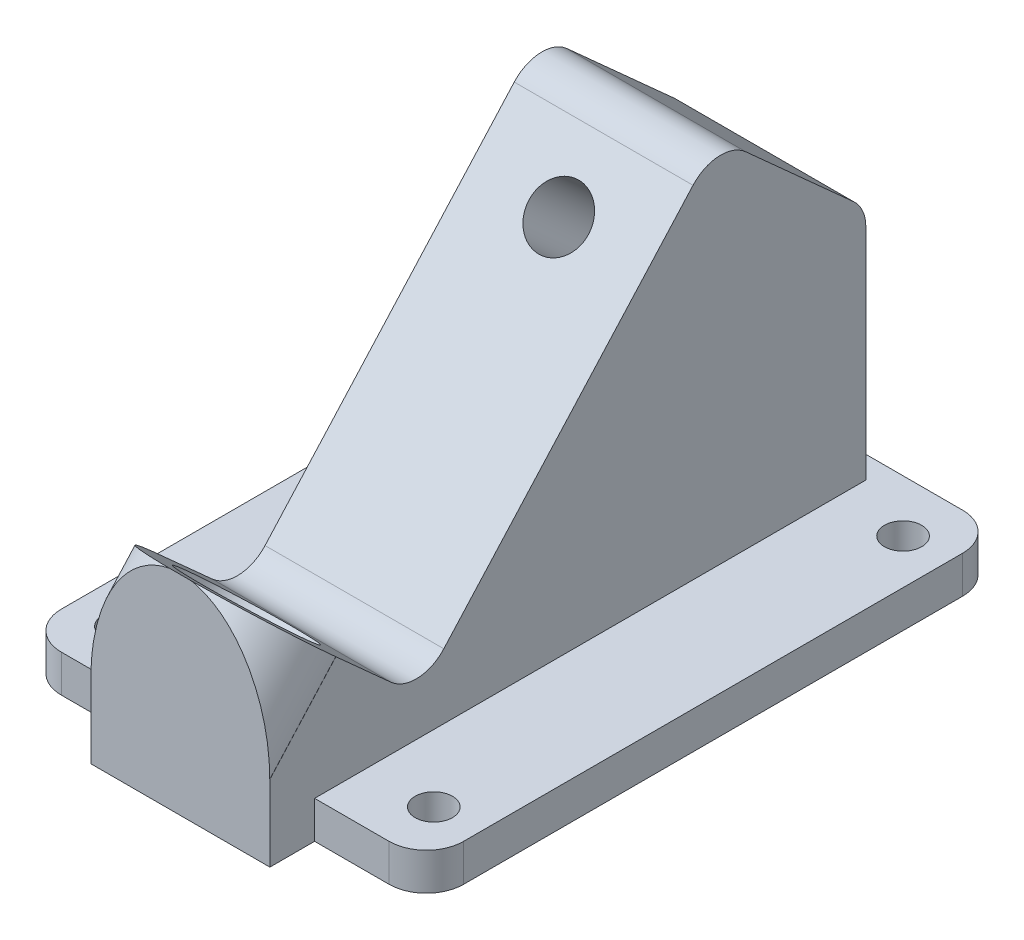
ISO-10303-21;
HEADER;
FILE_DESCRIPTION(('STEP AP214'),'2;1');
FILE_NAME('part.step','',(''),(''),'','','');
FILE_SCHEMA(('AUTOMOTIVE_DESIGN { 1 0 10303 214 1 1 1 1 }'));
ENDSEC;
DATA;
#1=APPLICATION_CONTEXT('core data for automotive mechanical design processes');
#2=APPLICATION_PROTOCOL_DEFINITION('international standard','automotive_design',2000,#1);
#3=PRODUCT_CONTEXT('',#1,'mechanical');
#4=PRODUCT('Part','Part','',(#3));
#5=PRODUCT_RELATED_PRODUCT_CATEGORY('part','',(#4));
#6=PRODUCT_DEFINITION_FORMATION('','',#4);
#7=PRODUCT_DEFINITION_CONTEXT('part definition',#1,'design');
#8=PRODUCT_DEFINITION('design','',#6,#7);
#9=PRODUCT_DEFINITION_SHAPE('','',#8);
#10=(LENGTH_UNIT() NAMED_UNIT(*) SI_UNIT(.MILLI.,.METRE.));
#11=(NAMED_UNIT(*) PLANE_ANGLE_UNIT() SI_UNIT($,.RADIAN.));
#12=(NAMED_UNIT(*) SI_UNIT($,.STERADIAN.) SOLID_ANGLE_UNIT());
#13=UNCERTAINTY_MEASURE_WITH_UNIT(LENGTH_MEASURE(1.E-05),#10,'distance_accuracy_value','');
#14=(GEOMETRIC_REPRESENTATION_CONTEXT(3) GLOBAL_UNCERTAINTY_ASSIGNED_CONTEXT((#13)) GLOBAL_UNIT_ASSIGNED_CONTEXT((#10,
#11,#12)) REPRESENTATION_CONTEXT('',''));
#15=CARTESIAN_POINT('',(0.,0.,0.));
#16=DIRECTION('',(0.,0.,1.));
#17=DIRECTION('',(1.,0.,0.));
#18=AXIS2_PLACEMENT_3D('',#15,#16,#17);
#19=CARTESIAN_POINT('',(-12.,-83.5224520712844,-35.5));
#20=DIRECTION('',(0.,0.,-1.));
#21=DIRECTION('',(-1.,0.,0.));
#22=AXIS2_PLACEMENT_3D('',#19,#20,#21);
#23=PLANE('',#22);
#24=DIRECTION('',(0.,1.,0.));
#25=VECTOR('',#24,1.);
#26=CARTESIAN_POINT('',(-12.,-83.5224520712844,-35.5));
#27=LINE('',#26,#25);
#28=CARTESIAN_POINT('',(-12.,5.,-35.5));
#29=VERTEX_POINT('',#28);
#30=CARTESIAN_POINT('',(-12.,34.4875776919696,-35.5));
#31=VERTEX_POINT('',#30);
#32=EDGE_CURVE('E266',#29,#31,#27,.T.);
#33=ORIENTED_EDGE('',*,*,#32,.T.);
#34=DIRECTION('',(-1.,0.,0.));
#35=VECTOR('',#34,1.);
#36=CARTESIAN_POINT('',(12.,34.4875776919696,-35.5));
#37=LINE('',#36,#35);
#38=CARTESIAN_POINT('',(12.,34.4875776919696,-35.5));
#39=VERTEX_POINT('',#38);
#40=EDGE_CURVE('E344',#31,#39,#37,.F.);
#41=ORIENTED_EDGE('',*,*,#40,.T.);
#42=DIRECTION('',(0.,1.,0.));
#43=VECTOR('',#42,1.);
#44=CARTESIAN_POINT('',(12.,-83.5224520712844,-35.5));
#45=LINE('',#44,#43);
#46=CARTESIAN_POINT('',(12.,5.,-35.5));
#47=VERTEX_POINT('',#46);
#48=EDGE_CURVE('E269',#47,#39,#45,.T.);
#49=ORIENTED_EDGE('',*,*,#48,.F.);
#50=DIRECTION('',(1.,0.,0.));
#51=VECTOR('',#50,1.);
#52=CARTESIAN_POINT('',(0.,5.,-35.5));
#53=LINE('',#52,#51);
#54=EDGE_CURVE('E297',#29,#47,#53,.T.);
#55=ORIENTED_EDGE('',*,*,#54,.F.);
#56=EDGE_LOOP('',(#33,#41,#49,#55));
#57=FACE_BOUND('',#56,.T.);
#58=DIRECTION('',(1.,0.,0.));
#59=VECTOR('',#58,1.);
#60=CARTESIAN_POINT('',(-12.,9.38530614584432,-35.5));
#61=LINE('',#60,#59);
#62=CARTESIAN_POINT('',(-4.05547720070579,9.38530614584432,-35.5));
#63=VERTEX_POINT('',#62);
#64=CARTESIAN_POINT('',(4.05547720070578,9.38530614584432,-35.5));
#65=VERTEX_POINT('',#64);
#66=EDGE_CURVE('E353',#63,#65,#61,.T.);
#67=ORIENTED_EDGE('',*,*,#66,.T.);
#68=CARTESIAN_POINT('',(0.,17.874862904023,-35.5));
#69=DIRECTION('',(0.,0.,-1.));
#70=DIRECTION('',(0.,-1.,0.));
#71=AXIS2_PLACEMENT_3D('',#68,#69,#70);
#72=ELLIPSE('',#71,10.0922454720478,7.5);
#73=EDGE_CURVE('E358',#65,#63,#72,.F.);
#74=ORIENTED_EDGE('',*,*,#73,.T.);
#75=EDGE_LOOP('',(#67,#74));
#76=FACE_BOUND('',#75,.T.);
#77=ADVANCED_FACE('F37',(#57,#76),#23,.T.);
#78=CARTESIAN_POINT('',(-27.,5.,38.5));
#79=DIRECTION('',(0.,0.,-1.));
#80=DIRECTION('',(-1.,0.,0.));
#81=AXIS2_PLACEMENT_3D('',#78,#79,#80);
#82=PLANE('',#81);
#83=DIRECTION('',(1.,0.,0.));
#84=VECTOR('',#83,1.);
#85=CARTESIAN_POINT('',(-27.,5.,38.5));
#86=LINE('',#85,#84);
#87=CARTESIAN_POINT('',(-22.,5.,38.5));
#88=VERTEX_POINT('',#87);
#89=CARTESIAN_POINT('',(-12.,5.,38.5));
#90=VERTEX_POINT('',#89);
#91=EDGE_CURVE('E312',#88,#90,#86,.T.);
#92=ORIENTED_EDGE('',*,*,#91,.F.);
#93=DIRECTION('',(0.,-1.,0.));
#94=VECTOR('',#93,1.);
#95=CARTESIAN_POINT('',(-22.,5.,38.5));
#96=LINE('',#95,#94);
#97=CARTESIAN_POINT('',(-22.,0.,38.5));
#98=VERTEX_POINT('',#97);
#99=EDGE_CURVE('E361',#88,#98,#96,.T.);
#100=ORIENTED_EDGE('',*,*,#99,.T.);
#101=DIRECTION('',(1.,0.,0.));
#102=VECTOR('',#101,1.);
#103=CARTESIAN_POINT('',(-27.,0.,38.5));
#104=LINE('',#103,#102);
#105=CARTESIAN_POINT('',(-12.,0.,38.5));
#106=VERTEX_POINT('',#105);
#107=EDGE_CURVE('E305',#98,#106,#104,.T.);
#108=ORIENTED_EDGE('',*,*,#107,.T.);
#109=DIRECTION('',(0.,1.,0.));
#110=VECTOR('',#109,1.);
#111=CARTESIAN_POINT('',(-12.,5.,38.5));
#112=LINE('',#111,#110);
#113=EDGE_CURVE('E294',#106,#90,#112,.T.);
#114=ORIENTED_EDGE('',*,*,#113,.T.);
#115=EDGE_LOOP('',(#92,#100,#108,#114));
#116=FACE_BOUND('',#115,.T.);
#117=ADVANCED_FACE('F413',(#116),#82,.F.);
#118=CARTESIAN_POINT('',(27.,5.,38.5));
#119=DIRECTION('',(-1.,0.,0.));
#120=DIRECTION('',(0.,0.,1.));
#121=AXIS2_PLACEMENT_3D('',#118,#119,#120);
#122=PLANE('',#121);
#123=DIRECTION('',(0.,0.,-1.));
#124=VECTOR('',#123,1.);
#125=CARTESIAN_POINT('',(27.,0.,38.5));
#126=LINE('',#125,#124);
#127=CARTESIAN_POINT('',(27.,0.,33.5));
#128=VERTEX_POINT('',#127);
#129=CARTESIAN_POINT('',(27.,0.,-33.5));
#130=VERTEX_POINT('',#129);
#131=EDGE_CURVE('E300',#128,#130,#126,.T.);
#132=ORIENTED_EDGE('',*,*,#131,.T.);
#133=DIRECTION('',(0.,-1.,0.));
#134=VECTOR('',#133,1.);
#135=CARTESIAN_POINT('',(27.,5.,-33.5));
#136=LINE('',#135,#134);
#137=CARTESIAN_POINT('',(27.,5.,-33.5));
#138=VERTEX_POINT('',#137);
#139=EDGE_CURVE('E393',#130,#138,#136,.F.);
#140=ORIENTED_EDGE('',*,*,#139,.T.);
#141=DIRECTION('',(0.,0.,-1.));
#142=VECTOR('',#141,1.);
#143=CARTESIAN_POINT('',(27.,5.,38.5));
#144=LINE('',#143,#142);
#145=CARTESIAN_POINT('',(27.,5.,33.5));
#146=VERTEX_POINT('',#145);
#147=EDGE_CURVE('E301',#146,#138,#144,.T.);
#148=ORIENTED_EDGE('',*,*,#147,.F.);
#149=DIRECTION('',(0.,-1.,0.));
#150=VECTOR('',#149,1.);
#151=CARTESIAN_POINT('',(27.,5.,33.5));
#152=LINE('',#151,#150);
#153=EDGE_CURVE('E390',#146,#128,#152,.T.);
#154=ORIENTED_EDGE('',*,*,#153,.T.);
#155=EDGE_LOOP('',(#132,#140,#148,#154));
#156=FACE_BOUND('',#155,.T.);
#157=ADVANCED_FACE('F421',(#156),#122,.F.);
#158=CARTESIAN_POINT('',(-27.,5.,-38.5));
#159=DIRECTION('',(0.,0.,1.));
#160=DIRECTION('',(1.,0.,0.));
#161=AXIS2_PLACEMENT_3D('',#158,#159,#160);
#162=PLANE('',#161);
#163=DIRECTION('',(-1.,0.,0.));
#164=VECTOR('',#163,1.);
#165=CARTESIAN_POINT('',(-27.,0.,-38.5));
#166=LINE('',#165,#164);
#167=CARTESIAN_POINT('',(22.,0.,-38.5));
#168=VERTEX_POINT('',#167);
#169=CARTESIAN_POINT('',(-22.,0.,-38.5));
#170=VERTEX_POINT('',#169);
#171=EDGE_CURVE('E316',#168,#170,#166,.T.);
#172=ORIENTED_EDGE('',*,*,#171,.T.);
#173=DIRECTION('',(0.,-1.,0.));
#174=VECTOR('',#173,1.);
#175=CARTESIAN_POINT('',(-22.,5.,-38.5));
#176=LINE('',#175,#174);
#177=CARTESIAN_POINT('',(-22.,5.,-38.5));
#178=VERTEX_POINT('',#177);
#179=EDGE_CURVE('E388',#170,#178,#176,.F.);
#180=ORIENTED_EDGE('',*,*,#179,.T.);
#181=DIRECTION('',(-1.,0.,0.));
#182=VECTOR('',#181,1.);
#183=CARTESIAN_POINT('',(-27.,5.,-38.5));
#184=LINE('',#183,#182);
#185=CARTESIAN_POINT('',(22.,5.,-38.5));
#186=VERTEX_POINT('',#185);
#187=EDGE_CURVE('E304',#186,#178,#184,.T.);
#188=ORIENTED_EDGE('',*,*,#187,.F.);
#189=DIRECTION('',(0.,-1.,0.));
#190=VECTOR('',#189,1.);
#191=CARTESIAN_POINT('',(22.,5.,-38.5));
#192=LINE('',#191,#190);
#193=EDGE_CURVE('E385',#186,#168,#192,.T.);
#194=ORIENTED_EDGE('',*,*,#193,.T.);
#195=EDGE_LOOP('',(#172,#180,#188,#194));
#196=FACE_BOUND('',#195,.T.);
#197=ADVANCED_FACE('F443',(#196),#162,.F.);
#198=CARTESIAN_POINT('',(-27.,5.,38.5));
#199=DIRECTION('',(1.,0.,0.));
#200=DIRECTION('',(0.,0.,-1.));
#201=AXIS2_PLACEMENT_3D('',#198,#199,#200);
#202=PLANE('',#201);
#203=DIRECTION('',(0.,0.,1.));
#204=VECTOR('',#203,1.);
#205=CARTESIAN_POINT('',(-27.,0.,38.5));
#206=LINE('',#205,#204);
#207=CARTESIAN_POINT('',(-27.,0.,-33.5));
#208=VERTEX_POINT('',#207);
#209=CARTESIAN_POINT('',(-27.,0.,33.5));
#210=VERTEX_POINT('',#209);
#211=EDGE_CURVE('E319',#208,#210,#206,.T.);
#212=ORIENTED_EDGE('',*,*,#211,.T.);
#213=DIRECTION('',(0.,-1.,0.));
#214=VECTOR('',#213,1.);
#215=CARTESIAN_POINT('',(-27.,5.,33.5));
#216=LINE('',#215,#214);
#217=CARTESIAN_POINT('',(-27.,5.,33.5));
#218=VERTEX_POINT('',#217);
#219=EDGE_CURVE('E375',#210,#218,#216,.F.);
#220=ORIENTED_EDGE('',*,*,#219,.T.);
#221=DIRECTION('',(0.,0.,1.));
#222=VECTOR('',#221,1.);
#223=CARTESIAN_POINT('',(-27.,5.,38.5));
#224=LINE('',#223,#222);
#225=CARTESIAN_POINT('',(-27.,5.,-33.5));
#226=VERTEX_POINT('',#225);
#227=EDGE_CURVE('E308',#226,#218,#224,.T.);
#228=ORIENTED_EDGE('',*,*,#227,.F.);
#229=DIRECTION('',(0.,-1.,0.));
#230=VECTOR('',#229,1.);
#231=CARTESIAN_POINT('',(-27.,5.,-33.5));
#232=LINE('',#231,#230);
#233=EDGE_CURVE('E372',#226,#208,#232,.T.);
#234=ORIENTED_EDGE('',*,*,#233,.T.);
#235=EDGE_LOOP('',(#212,#220,#228,#234));
#236=FACE_BOUND('',#235,.T.);
#237=ADVANCED_FACE('F439',(#236),#202,.F.);
#238=CARTESIAN_POINT('',(12.,0.,38.5));
#239=VERTEX_POINT('',#238);
#240=CARTESIAN_POINT('',(22.,0.,38.5));
#241=VERTEX_POINT('',#240);
#242=EDGE_CURVE('E322',#239,#241,#104,.T.);
#243=ORIENTED_EDGE('',*,*,#242,.T.);
#244=DIRECTION('',(0.,-1.,0.));
#245=VECTOR('',#244,1.);
#246=CARTESIAN_POINT('',(22.,5.,38.5));
#247=LINE('',#246,#245);
#248=CARTESIAN_POINT('',(22.,5.,38.5));
#249=VERTEX_POINT('',#248);
#250=EDGE_CURVE('E203',#241,#249,#247,.F.);
#251=ORIENTED_EDGE('',*,*,#250,.T.);
#252=CARTESIAN_POINT('',(12.,5.,38.5));
#253=VERTEX_POINT('',#252);
#254=EDGE_CURVE('E311',#253,#249,#86,.T.);
#255=ORIENTED_EDGE('',*,*,#254,.F.);
#256=DIRECTION('',(0.,-1.,0.));
#257=VECTOR('',#256,1.);
#258=CARTESIAN_POINT('',(12.,5.,38.5));
#259=LINE('',#258,#257);
#260=EDGE_CURVE('E288',#253,#239,#259,.T.);
#261=ORIENTED_EDGE('',*,*,#260,.T.);
#262=EDGE_LOOP('',(#243,#251,#255,#261));
#263=FACE_BOUND('',#262,.T.);
#264=ADVANCED_FACE('F424',(#263),#82,.F.);
#265=CARTESIAN_POINT('',(0.,5.,0.));
#266=DIRECTION('',(0.,-1.,0.));
#267=DIRECTION('',(0.,0.,-1.));
#268=AXIS2_PLACEMENT_3D('',#265,#266,#267);
#269=PLANE('',#268);
#270=CARTESIAN_POINT('',(21.,5.,-31.5));
#271=DIRECTION('',(0.,-1.,0.));
#272=DIRECTION('',(0.,0.,-1.));
#273=AXIS2_PLACEMENT_3D('',#270,#271,#272);
#274=CIRCLE('',#273,2.49999999999999);
#275=CARTESIAN_POINT('',(21.,5.,-34.));
#276=VERTEX_POINT('',#275);
#277=EDGE_CURVE('E219',#276,#276,#274,.T.);
#278=ORIENTED_EDGE('',*,*,#277,.T.);
#279=EDGE_LOOP('',(#278));
#280=FACE_BOUND('',#279,.T.);
#281=CARTESIAN_POINT('',(-21.,5.,-31.5));
#282=DIRECTION('',(0.,-1.,0.));
#283=DIRECTION('',(0.,0.,-1.));
#284=AXIS2_PLACEMENT_3D('',#281,#282,#283);
#285=CIRCLE('',#284,2.49999999999999);
#286=CARTESIAN_POINT('',(-21.,5.,-34.));
#287=VERTEX_POINT('',#286);
#288=EDGE_CURVE('E226',#287,#287,#285,.T.);
#289=ORIENTED_EDGE('',*,*,#288,.T.);
#290=EDGE_LOOP('',(#289));
#291=FACE_BOUND('',#290,.T.);
#292=CARTESIAN_POINT('',(-21.,5.,31.5));
#293=DIRECTION('',(0.,-1.,0.));
#294=DIRECTION('',(0.,0.,-1.));
#295=AXIS2_PLACEMENT_3D('',#292,#293,#294);
#296=CIRCLE('',#295,2.49999999999999);
#297=CARTESIAN_POINT('',(-21.,5.,29.));
#298=VERTEX_POINT('',#297);
#299=EDGE_CURVE('E232',#298,#298,#296,.T.);
#300=ORIENTED_EDGE('',*,*,#299,.T.);
#301=EDGE_LOOP('',(#300));
#302=FACE_BOUND('',#301,.T.);
#303=CARTESIAN_POINT('',(21.,5.,31.5));
#304=DIRECTION('',(0.,-1.,0.));
#305=DIRECTION('',(0.,0.,-1.));
#306=AXIS2_PLACEMENT_3D('',#303,#304,#305);
#307=CIRCLE('',#306,2.49999999999999);
#308=CARTESIAN_POINT('',(21.,5.,29.));
#309=VERTEX_POINT('',#308);
#310=EDGE_CURVE('E238',#309,#309,#307,.T.);
#311=ORIENTED_EDGE('',*,*,#310,.T.);
#312=EDGE_LOOP('',(#311));
#313=FACE_BOUND('',#312,.T.);
#314=ORIENTED_EDGE('',*,*,#227,.T.);
#315=CARTESIAN_POINT('',(-22.,5.,33.5));
#316=DIRECTION('',(0.,-1.,0.));
#317=DIRECTION('',(0.,0.,-1.));
#318=AXIS2_PLACEMENT_3D('',#315,#316,#317);
#319=CIRCLE('',#318,5.);
#320=EDGE_CURVE('E383',#218,#88,#319,.F.);
#321=ORIENTED_EDGE('',*,*,#320,.T.);
#322=ORIENTED_EDGE('',*,*,#91,.T.);
#323=DIRECTION('',(0.,0.,-1.));
#324=VECTOR('',#323,1.);
#325=CARTESIAN_POINT('',(-12.,5.,0.));
#326=LINE('',#325,#324);
#327=EDGE_CURVE('E291',#90,#29,#326,.T.);
#328=ORIENTED_EDGE('',*,*,#327,.T.);
#329=ORIENTED_EDGE('',*,*,#54,.T.);
#330=DIRECTION('',(0.,0.,1.));
#331=VECTOR('',#330,1.);
#332=CARTESIAN_POINT('',(12.,5.,0.));
#333=LINE('',#332,#331);
#334=EDGE_CURVE('E285',#47,#253,#333,.T.);
#335=ORIENTED_EDGE('',*,*,#334,.T.);
#336=ORIENTED_EDGE('',*,*,#254,.T.);
#337=CARTESIAN_POINT('',(22.,5.,33.5));
#338=DIRECTION('',(0.,-1.,0.));
#339=DIRECTION('',(0.,0.,-1.));
#340=AXIS2_PLACEMENT_3D('',#337,#338,#339);
#341=CIRCLE('',#340,5.);
#342=EDGE_CURVE('E377',#249,#146,#341,.F.);
#343=ORIENTED_EDGE('',*,*,#342,.T.);
#344=ORIENTED_EDGE('',*,*,#147,.T.);
#345=CARTESIAN_POINT('',(22.,5.,-33.5));
#346=DIRECTION('',(0.,-1.,0.));
#347=DIRECTION('',(0.,0.,-1.));
#348=AXIS2_PLACEMENT_3D('',#345,#346,#347);
#349=CIRCLE('',#348,5.);
#350=EDGE_CURVE('E379',#138,#186,#349,.F.);
#351=ORIENTED_EDGE('',*,*,#350,.T.);
#352=ORIENTED_EDGE('',*,*,#187,.T.);
#353=CARTESIAN_POINT('',(-22.,5.,-33.5));
#354=DIRECTION('',(0.,-1.,0.));
#355=DIRECTION('',(0.,0.,-1.));
#356=AXIS2_PLACEMENT_3D('',#353,#354,#355);
#357=CIRCLE('',#356,5.);
#358=EDGE_CURVE('E381',#178,#226,#357,.F.);
#359=ORIENTED_EDGE('',*,*,#358,.T.);
#360=EDGE_LOOP('',(#314,#321,#322,#328,#329,#335,#336,#343,#344,#351,#352,#359));
#361=FACE_BOUND('',#360,.T.);
#362=ADVANCED_FACE('F430',(#280,#291,#302,#313,#361),#269,.F.);
#363=CARTESIAN_POINT('',(0.,0.,0.));
#364=DIRECTION('',(0.,-1.,0.));
#365=DIRECTION('',(0.,0.,-1.));
#366=AXIS2_PLACEMENT_3D('',#363,#364,#365);
#367=PLANE('',#366);
#368=CARTESIAN_POINT('',(21.,0.,-31.5));
#369=DIRECTION('',(0.,-1.,0.));
#370=DIRECTION('',(0.,0.,-1.));
#371=AXIS2_PLACEMENT_3D('',#368,#369,#370);
#372=CIRCLE('',#371,2.49999999999999);
#373=CARTESIAN_POINT('',(21.,0.,-34.));
#374=VERTEX_POINT('',#373);
#375=EDGE_CURVE('E216',#374,#374,#372,.T.);
#376=ORIENTED_EDGE('',*,*,#375,.F.);
#377=EDGE_LOOP('',(#376));
#378=FACE_BOUND('',#377,.T.);
#379=CARTESIAN_POINT('',(-21.,0.,-31.5));
#380=DIRECTION('',(0.,-1.,0.));
#381=DIRECTION('',(0.,0.,-1.));
#382=AXIS2_PLACEMENT_3D('',#379,#380,#381);
#383=CIRCLE('',#382,2.49999999999999);
#384=CARTESIAN_POINT('',(-21.,0.,-34.));
#385=VERTEX_POINT('',#384);
#386=EDGE_CURVE('E223',#385,#385,#383,.T.);
#387=ORIENTED_EDGE('',*,*,#386,.F.);
#388=EDGE_LOOP('',(#387));
#389=FACE_BOUND('',#388,.T.);
#390=CARTESIAN_POINT('',(-21.,0.,31.5));
#391=DIRECTION('',(0.,-1.,0.));
#392=DIRECTION('',(0.,0.,-1.));
#393=AXIS2_PLACEMENT_3D('',#390,#391,#392);
#394=CIRCLE('',#393,2.49999999999999);
#395=CARTESIAN_POINT('',(-21.,0.,29.));
#396=VERTEX_POINT('',#395);
#397=EDGE_CURVE('E229',#396,#396,#394,.T.);
#398=ORIENTED_EDGE('',*,*,#397,.F.);
#399=EDGE_LOOP('',(#398));
#400=FACE_BOUND('',#399,.T.);
#401=CARTESIAN_POINT('',(21.,0.,31.5));
#402=DIRECTION('',(0.,-1.,0.));
#403=DIRECTION('',(0.,0.,-1.));
#404=AXIS2_PLACEMENT_3D('',#401,#402,#403);
#405=CIRCLE('',#404,2.49999999999999);
#406=CARTESIAN_POINT('',(21.,0.,29.));
#407=VERTEX_POINT('',#406);
#408=EDGE_CURVE('E235',#407,#407,#405,.T.);
#409=ORIENTED_EDGE('',*,*,#408,.F.);
#410=EDGE_LOOP('',(#409));
#411=FACE_BOUND('',#410,.T.);
#412=ORIENTED_EDGE('',*,*,#107,.F.);
#413=CARTESIAN_POINT('',(-22.,0.,33.5));
#414=DIRECTION('',(0.,-1.,0.));
#415=DIRECTION('',(0.,0.,-1.));
#416=AXIS2_PLACEMENT_3D('',#413,#414,#415);
#417=CIRCLE('',#416,5.);
#418=EDGE_CURVE('E370',#98,#210,#417,.T.);
#419=ORIENTED_EDGE('',*,*,#418,.T.);
#420=ORIENTED_EDGE('',*,*,#211,.F.);
#421=CARTESIAN_POINT('',(-22.,0.,-33.5));
#422=DIRECTION('',(0.,-1.,0.));
#423=DIRECTION('',(0.,0.,-1.));
#424=AXIS2_PLACEMENT_3D('',#421,#422,#423);
#425=CIRCLE('',#424,5.);
#426=EDGE_CURVE('E368',#208,#170,#425,.T.);
#427=ORIENTED_EDGE('',*,*,#426,.T.);
#428=ORIENTED_EDGE('',*,*,#171,.F.);
#429=CARTESIAN_POINT('',(22.,0.,-33.5));
#430=DIRECTION('',(0.,-1.,0.));
#431=DIRECTION('',(0.,0.,-1.));
#432=AXIS2_PLACEMENT_3D('',#429,#430,#431);
#433=CIRCLE('',#432,5.);
#434=EDGE_CURVE('E366',#168,#130,#433,.T.);
#435=ORIENTED_EDGE('',*,*,#434,.T.);
#436=ORIENTED_EDGE('',*,*,#131,.F.);
#437=CARTESIAN_POINT('',(22.,0.,33.5));
#438=DIRECTION('',(0.,-1.,0.));
#439=DIRECTION('',(0.,0.,-1.));
#440=AXIS2_PLACEMENT_3D('',#437,#438,#439);
#441=CIRCLE('',#440,5.);
#442=EDGE_CURVE('E364',#128,#241,#441,.T.);
#443=ORIENTED_EDGE('',*,*,#442,.T.);
#444=ORIENTED_EDGE('',*,*,#242,.F.);
#445=DIRECTION('',(0.,0.,-1.));
#446=VECTOR('',#445,1.);
#447=CARTESIAN_POINT('',(12.,0.,-35.5));
#448=LINE('',#447,#446);
#449=CARTESIAN_POINT('',(12.,0.,44.5));
#450=VERTEX_POINT('',#449);
#451=EDGE_CURVE('E267',#450,#239,#448,.T.);
#452=ORIENTED_EDGE('',*,*,#451,.F.);
#453=DIRECTION('',(1.,0.,0.));
#454=VECTOR('',#453,1.);
#455=CARTESIAN_POINT('',(-12.,0.,44.5));
#456=LINE('',#455,#454);
#457=CARTESIAN_POINT('',(-12.,0.,44.5));
#458=VERTEX_POINT('',#457);
#459=EDGE_CURVE('E271',#458,#450,#456,.T.);
#460=ORIENTED_EDGE('',*,*,#459,.F.);
#461=DIRECTION('',(0.,0.,1.));
#462=VECTOR('',#461,1.);
#463=CARTESIAN_POINT('',(-12.,0.,-35.5));
#464=LINE('',#463,#462);
#465=EDGE_CURVE('E275',#106,#458,#464,.T.);
#466=ORIENTED_EDGE('',*,*,#465,.F.);
#467=EDGE_LOOP('',(#412,#419,#420,#427,#428,#435,#436,#443,#444,#452,#460,#466));
#468=FACE_BOUND('',#467,.T.);
#469=ADVANCED_FACE('F433',(#378,#389,#400,#411,#468),#367,.T.);
#470=CARTESIAN_POINT('',(-12.,-83.5224520712844,-35.5));
#471=DIRECTION('',(-1.,0.,0.));
#472=DIRECTION('',(0.,0.,1.));
#473=AXIS2_PLACEMENT_3D('',#470,#471,#472);
#474=PLANE('',#473);
#475=DIRECTION('',(0.,0.743144825477396,-0.669130606358857));
#476=VECTOR('',#475,1.);
#477=CARTESIAN_POINT('',(-12.,5.01690067115088,50.0718326710352));
#478=LINE('',#477,#476);
#479=CARTESIAN_POINT('',(-12.,20.4847619411719,36.1445078268704));
#480=VERTEX_POINT('',#479);
#481=CARTESIAN_POINT('',(-12.,11.2050477661367,44.5));
#482=VERTEX_POINT('',#481);
#483=EDGE_CURVE('E214',#480,#482,#478,.F.);
#484=ORIENTED_EDGE('',*,*,#483,.F.);
#485=DIRECTION('',(0.,0.669130606358856,0.743144825477396));
#486=VECTOR('',#485,1.);
#487=CARTESIAN_POINT('',(-12.,-61.7090037986731,-55.1409170447409));
#488=LINE('',#487,#486);
#489=CARTESIAN_POINT('',(-12.,13.3456530317943,28.215724127387));
#490=VERTEX_POINT('',#489);
#491=EDGE_CURVE('E258',#490,#480,#488,.T.);
#492=ORIENTED_EDGE('',*,*,#491,.F.);
#493=CARTESIAN_POINT('',(-12.,17.0613771591813,24.8700710955927));
#494=DIRECTION('',(-1.,0.,0.));
#495=DIRECTION('',(0.,0.,1.));
#496=AXIS2_PLACEMENT_3D('',#493,#494,#495);
#497=CIRCLE('',#496,5.);
#498=CARTESIAN_POINT('',(-12.,13.715724127387,21.1543469682057));
#499=VERTEX_POINT('',#498);
#500=EDGE_CURVE('E351',#490,#499,#497,.F.);
#501=ORIENTED_EDGE('',*,*,#500,.T.);
#502=DIRECTION('',(0.,-0.743144825477396,0.669130606358857));
#503=VECTOR('',#502,1.);
#504=CARTESIAN_POINT('',(-12.,-11.8134482726113,44.1409170447408));
#505=LINE('',#504,#503);
#506=CARTESIAN_POINT('',(-12.,50.8729654012568,-12.3021833497371));
#507=VERTEX_POINT('',#506);
#508=EDGE_CURVE('E263',#507,#499,#505,.T.);
#509=ORIENTED_EDGE('',*,*,#508,.F.);
#510=CARTESIAN_POINT('',(-12.,47.5273123694625,-16.0179074771241));
#511=DIRECTION('',(-1.,0.,0.));
#512=DIRECTION('',(0.,0.,1.));
#513=AXIS2_PLACEMENT_3D('',#510,#511,#512);
#514=CIRCLE('',#513,5.);
#515=CARTESIAN_POINT('',(-12.,51.2430364968494,-19.3635605089184));
#516=VERTEX_POINT('',#515);
#517=EDGE_CURVE('E342',#507,#516,#514,.T.);
#518=ORIENTED_EDGE('',*,*,#517,.T.);
#519=DIRECTION('',(0.,0.669130606358856,0.743144825477396));
#520=VECTOR('',#519,1.);
#521=CARTESIAN_POINT('',(-12.,-17.1203142700294,-95.2887534262722));
#522=LINE('',#521,#520);
#523=CARTESIAN_POINT('',(-12.,38.2033018193565,-33.8456530317943));
#524=VERTEX_POINT('',#523);
#525=EDGE_CURVE('E260',#524,#516,#522,.T.);
#526=ORIENTED_EDGE('',*,*,#525,.F.);
#527=CARTESIAN_POINT('',(-12.,34.4875776919696,-30.5));
#528=DIRECTION('',(-1.,0.,0.));
#529=DIRECTION('',(0.,0.,1.));
#530=AXIS2_PLACEMENT_3D('',#527,#528,#529);
#531=CIRCLE('',#530,5.);
#532=EDGE_CURVE('E340',#524,#31,#531,.T.);
#533=ORIENTED_EDGE('',*,*,#532,.T.);
#534=ORIENTED_EDGE('',*,*,#32,.F.);
#535=ORIENTED_EDGE('',*,*,#327,.F.);
#536=ORIENTED_EDGE('',*,*,#113,.F.);
#537=ORIENTED_EDGE('',*,*,#465,.T.);
#538=DIRECTION('',(0.,1.,0.));
#539=VECTOR('',#538,1.);
#540=CARTESIAN_POINT('',(-12.,-83.5224520712844,44.5));
#541=LINE('',#540,#539);
#542=EDGE_CURVE('E274',#458,#482,#541,.T.);
#543=ORIENTED_EDGE('',*,*,#542,.T.);
#544=EDGE_LOOP('',(#484,#492,#501,#509,#518,#526,#533,#534,#535,#536,#537,#543));
#545=FACE_BOUND('',#544,.T.);
#546=ADVANCED_FACE('F428',(#545),#474,.T.);
#547=CARTESIAN_POINT('',(12.,-83.5224520712844,-35.5));
#548=DIRECTION('',(1.,0.,0.));
#549=DIRECTION('',(0.,0.,-1.));
#550=AXIS2_PLACEMENT_3D('',#547,#548,#549);
#551=PLANE('',#550);
#552=DIRECTION('',(0.,0.743144825477396,-0.669130606358857));
#553=VECTOR('',#552,1.);
#554=CARTESIAN_POINT('',(12.,-1.7764891772284,55.2880894269018));
#555=LINE('',#554,#553);
#556=CARTESIAN_POINT('',(12.,10.2048979513852,44.5));
#557=VERTEX_POINT('',#556);
#558=CARTESIAN_POINT('',(12.,20.0369590953828,35.6471723821609));
#559=VERTEX_POINT('',#558);
#560=EDGE_CURVE('E59',#557,#559,#555,.T.);
#561=ORIENTED_EDGE('',*,*,#560,.F.);
#562=DIRECTION('',(0.,1.,0.));
#563=VECTOR('',#562,1.);
#564=CARTESIAN_POINT('',(12.,-83.5224520712844,44.5));
#565=LINE('',#564,#563);
#566=EDGE_CURVE('E270',#450,#557,#565,.T.);
#567=ORIENTED_EDGE('',*,*,#566,.F.);
#568=ORIENTED_EDGE('',*,*,#451,.T.);
#569=ORIENTED_EDGE('',*,*,#260,.F.);
#570=ORIENTED_EDGE('',*,*,#334,.F.);
#571=ORIENTED_EDGE('',*,*,#48,.T.);
#572=CARTESIAN_POINT('',(12.,34.4875776919696,-30.5));
#573=DIRECTION('',(1.,0.,0.));
#574=DIRECTION('',(0.,0.,-1.));
#575=AXIS2_PLACEMENT_3D('',#572,#573,#574);
#576=CIRCLE('',#575,5.);
#577=CARTESIAN_POINT('',(12.,38.2033018193565,-33.8456530317943));
#578=VERTEX_POINT('',#577);
#579=EDGE_CURVE('E331',#39,#578,#576,.T.);
#580=ORIENTED_EDGE('',*,*,#579,.T.);
#581=DIRECTION('',(0.,-0.669130606358856,-0.743144825477396));
#582=VECTOR('',#581,1.);
#583=CARTESIAN_POINT('',(12.,54.5886895286437,-15.6478363815314));
#584=LINE('',#583,#582);
#585=CARTESIAN_POINT('',(12.,51.2430364968495,-19.3635605089184));
#586=VERTEX_POINT('',#585);
#587=EDGE_CURVE('E253',#586,#578,#584,.T.);
#588=ORIENTED_EDGE('',*,*,#587,.F.);
#589=CARTESIAN_POINT('',(12.,47.5273123694625,-16.0179074771241));
#590=DIRECTION('',(1.,0.,0.));
#591=DIRECTION('',(0.,0.,-1.));
#592=AXIS2_PLACEMENT_3D('',#589,#590,#591);
#593=CIRCLE('',#592,5.);
#594=CARTESIAN_POINT('',(12.,50.8729654012568,-12.3021833497371));
#595=VERTEX_POINT('',#594);
#596=EDGE_CURVE('E333',#586,#595,#593,.T.);
#597=ORIENTED_EDGE('',*,*,#596,.T.);
#598=DIRECTION('',(0.,0.743144825477396,-0.669130606358857));
#599=VECTOR('',#598,1.);
#600=CARTESIAN_POINT('',(12.,10.,24.5));
#601=LINE('',#600,#599);
#602=CARTESIAN_POINT('',(12.,13.715724127387,21.1543469682057));
#603=VERTEX_POINT('',#602);
#604=EDGE_CURVE('E250',#603,#595,#601,.T.);
#605=ORIENTED_EDGE('',*,*,#604,.F.);
#606=CARTESIAN_POINT('',(12.,17.0613771591813,24.8700710955927));
#607=DIRECTION('',(1.,0.,0.));
#608=DIRECTION('',(0.,0.,-1.));
#609=AXIS2_PLACEMENT_3D('',#606,#607,#608);
#610=CIRCLE('',#609,5.);
#611=CARTESIAN_POINT('',(12.,13.3456530317943,28.215724127387));
#612=VERTEX_POINT('',#611);
#613=EDGE_CURVE('E348',#603,#612,#610,.F.);
#614=ORIENTED_EDGE('',*,*,#613,.T.);
#615=DIRECTION('',(0.,-0.669130606358856,-0.743144825477396));
#616=VECTOR('',#615,1.);
#617=CARTESIAN_POINT('',(12.,30.0739181907657,46.7943447643219));
#618=LINE('',#617,#616);
#619=EDGE_CURVE('E256',#559,#612,#618,.T.);
#620=ORIENTED_EDGE('',*,*,#619,.F.);
#621=EDGE_LOOP('',(#561,#567,#568,#569,#570,#571,#580,#588,#597,#605,#614,#620));
#622=FACE_BOUND('',#621,.T.);
#623=ADVANCED_FACE('F533',(#622),#551,.T.);
#624=CARTESIAN_POINT('',(-12.,-83.5224520712844,44.5));
#625=DIRECTION('',(0.,0.,1.));
#626=DIRECTION('',(1.,0.,0.));
#627=AXIS2_PLACEMENT_3D('',#624,#625,#626);
#628=PLANE('',#627);
#629=CARTESIAN_POINT('',(-0.0186757799173561,10.2048979513852,44.5));
#630=DIRECTION('',(0.,0.,1.));
#631=DIRECTION('',(0.,1.,0.));
#632=AXIS2_PLACEMENT_3D('',#629,#630,#631);
#633=ELLIPSE('',#632,17.9337185983753,12.);
#634=CARTESIAN_POINT('',(-1.46389568313786,28.0080808859567,44.5));
#635=VERTEX_POINT('',#634);
#636=EDGE_CURVE('E52',#482,#635,#633,.F.);
#637=ORIENTED_EDGE('',*,*,#636,.F.);
#638=ORIENTED_EDGE('',*,*,#542,.F.);
#639=ORIENTED_EDGE('',*,*,#459,.T.);
#640=ORIENTED_EDGE('',*,*,#566,.T.);
#641=DIRECTION('',(1.,0.,0.));
#642=VECTOR('',#641,1.);
#643=CARTESIAN_POINT('',(-12.,10.2048979513852,44.5));
#644=LINE('',#643,#642);
#645=CARTESIAN_POINT('',(11.9813242200826,10.2048979513852,44.5));
#646=VERTEX_POINT('',#645);
#647=EDGE_CURVE('E198',#646,#557,#644,.T.);
#648=ORIENTED_EDGE('',*,*,#647,.F.);
#649=CARTESIAN_POINT('',(1.42654412330315,28.0080808859567,44.5));
#650=VERTEX_POINT('',#649);
#651=EDGE_CURVE('E196',#650,#646,#633,.F.);
#652=ORIENTED_EDGE('',*,*,#651,.F.);
#653=DIRECTION('',(1.,0.,0.));
#654=VECTOR('',#653,1.);
#655=CARTESIAN_POINT('',(-12.,28.0080808859567,44.5));
#656=LINE('',#655,#654);
#657=EDGE_CURVE('E208',#635,#650,#656,.T.);
#658=ORIENTED_EDGE('',*,*,#657,.F.);
#659=EDGE_LOOP('',(#637,#638,#639,#640,#648,#652,#658));
#660=FACE_BOUND('',#659,.T.);
#661=ADVANCED_FACE('F505',(#660),#628,.T.);
#662=CARTESIAN_POINT('',(-27.,10.,24.5));
#663=DIRECTION('',(0.,-0.669130606358857,-0.743144825477396));
#664=DIRECTION('',(0.,0.743144825477396,-0.669130606358857));
#665=AXIS2_PLACEMENT_3D('',#662,#663,#664);
#666=PLANE('',#665);
#667=CARTESIAN_POINT('',(0.,44.1846619719602,-6.2800078925074));
#668=DIRECTION('',(0.,0.669130606358857,0.743144825477396));
#669=DIRECTION('',(0.,-0.743144825477396,0.669130606358857));
#670=AXIS2_PLACEMENT_3D('',#667,#668,#669);
#671=CIRCLE('',#670,4.00000000000001);
#672=CARTESIAN_POINT('',(0.,41.2120826700506,-3.60348546707197));
#673=VERTEX_POINT('',#672);
#674=EDGE_CURVE('E247',#673,#673,#671,.T.);
#675=ORIENTED_EDGE('',*,*,#674,.F.);
#676=EDGE_LOOP('',(#675));
#677=FACE_BOUND('',#676,.T.);
#678=ORIENTED_EDGE('',*,*,#604,.T.);
#679=DIRECTION('',(1.,0.,0.));
#680=VECTOR('',#679,1.);
#681=CARTESIAN_POINT('',(-27.,50.8729654012568,-12.3021833497371));
#682=LINE('',#681,#680);
#683=EDGE_CURVE('E338',#595,#507,#682,.F.);
#684=ORIENTED_EDGE('',*,*,#683,.T.);
#685=ORIENTED_EDGE('',*,*,#508,.T.);
#686=DIRECTION('',(1.,0.,0.));
#687=VECTOR('',#686,1.);
#688=CARTESIAN_POINT('',(12.,13.715724127387,21.1543469682057));
#689=LINE('',#688,#687);
#690=EDGE_CURVE('E335',#499,#603,#689,.T.);
#691=ORIENTED_EDGE('',*,*,#690,.T.);
#692=EDGE_LOOP('',(#678,#684,#685,#691));
#693=FACE_BOUND('',#692,.T.);
#694=ADVANCED_FACE('F513',(#677,#693),#666,.F.);
#695=CARTESIAN_POINT('',(-27.,30.0739181907657,46.7943447643219));
#696=DIRECTION('',(0.,-0.743144825477396,0.669130606358856));
#697=DIRECTION('',(0.,-0.669130606358856,-0.743144825477396));
#698=AXIS2_PLACEMENT_3D('',#695,#696,#697);
#699=PLANE('',#698);
#700=CARTESIAN_POINT('',(0.,20.0369590953828,35.6471723821609));
#701=DIRECTION('',(0.,-0.743144825477396,0.669130606358856));
#702=DIRECTION('',(0.,-0.669130606358856,-0.743144825477396));
#703=AXIS2_PLACEMENT_3D('',#700,#701,#702);
#704=CIRCLE('',#703,8.);
#705=CARTESIAN_POINT('',(0.,14.683914244512,29.7020137783418));
#706=VERTEX_POINT('',#705);
#707=EDGE_CURVE('E220',#706,#706,#704,.T.);
#708=ORIENTED_EDGE('',*,*,#707,.T.);
#709=EDGE_LOOP('',(#708));
#710=FACE_BOUND('',#709,.T.);
#711=ORIENTED_EDGE('',*,*,#491,.T.);
#712=CARTESIAN_POINT('',(-0.0186757799173569,20.0369590953828,35.6471723821609));
#713=DIRECTION('',(0.,-0.743144825477396,0.669130606358856));
#714=DIRECTION('',(0.,-0.669130606358856,-0.743144825477396));
#715=AXIS2_PLACEMENT_3D('',#712,#713,#714);
#716=CIRCLE('',#715,12.);
#717=EDGE_CURVE('E11',#480,#635,#716,.F.);
#718=ORIENTED_EDGE('',*,*,#717,.T.);
#719=ORIENTED_EDGE('',*,*,#657,.T.);
#720=CARTESIAN_POINT('',(-0.0186757799173569,20.0369590953829,35.6471723821609));
#721=DIRECTION('',(0.,-0.743144825477396,0.669130606358857));
#722=DIRECTION('',(0.,0.669130606358857,0.743144825477396));
#723=AXIS2_PLACEMENT_3D('',#720,#721,#722);
#724=CIRCLE('',#723,12.);
#725=CARTESIAN_POINT('',(11.9813242200826,20.0369590953829,35.6471723821609));
#726=VERTEX_POINT('',#725);
#727=EDGE_CURVE('E194',#726,#650,#724,.T.);
#728=ORIENTED_EDGE('',*,*,#727,.F.);
#729=DIRECTION('',(1.,0.,0.));
#730=VECTOR('',#729,1.);
#731=CARTESIAN_POINT('',(-27.,20.0369590953828,35.6471723821609));
#732=LINE('',#731,#730);
#733=EDGE_CURVE('E45',#726,#559,#732,.T.);
#734=ORIENTED_EDGE('',*,*,#733,.T.);
#735=ORIENTED_EDGE('',*,*,#619,.T.);
#736=DIRECTION('',(1.,0.,0.));
#737=VECTOR('',#736,1.);
#738=CARTESIAN_POINT('',(-12.,13.3456530317943,28.215724127387));
#739=LINE('',#738,#737);
#740=EDGE_CURVE('E346',#612,#490,#739,.F.);
#741=ORIENTED_EDGE('',*,*,#740,.T.);
#742=EDGE_LOOP('',(#711,#718,#719,#728,#734,#735,#741));
#743=FACE_BOUND('',#742,.T.);
#744=ADVANCED_FACE('F206',(#710,#743),#699,.F.);
#745=CARTESIAN_POINT('',(-27.,54.5886895286437,-15.6478363815314));
#746=DIRECTION('',(0.,-0.743144825477396,0.669130606358856));
#747=DIRECTION('',(0.,-0.669130606358856,-0.743144825477396));
#748=AXIS2_PLACEMENT_3D('',#745,#746,#747);
#749=PLANE('',#748);
#750=ORIENTED_EDGE('',*,*,#525,.T.);
#751=DIRECTION('',(1.,0.,0.));
#752=VECTOR('',#751,1.);
#753=CARTESIAN_POINT('',(-27.,51.2430364968495,-19.3635605089184));
#754=LINE('',#753,#752);
#755=EDGE_CURVE('E328',#516,#586,#754,.T.);
#756=ORIENTED_EDGE('',*,*,#755,.T.);
#757=ORIENTED_EDGE('',*,*,#587,.T.);
#758=DIRECTION('',(-1.,0.,0.));
#759=VECTOR('',#758,1.);
#760=CARTESIAN_POINT('',(-12.,38.2033018193565,-33.8456530317943));
#761=LINE('',#760,#759);
#762=EDGE_CURVE('E325',#578,#524,#761,.T.);
#763=ORIENTED_EDGE('',*,*,#762,.T.);
#764=EDGE_LOOP('',(#750,#756,#757,#763));
#765=FACE_BOUND('',#764,.T.);
#766=ADVANCED_FACE('F519',(#765),#749,.F.);
#767=CARTESIAN_POINT('',(0.,8.3798645841979,-46.04526396228));
#768=DIRECTION('',(0.,0.669130606358857,0.743144825477396));
#769=DIRECTION('',(0.,-0.743144825477396,0.669130606358857));
#770=AXIS2_PLACEMENT_3D('',#767,#768,#769);
#771=CYLINDRICAL_SURFACE('',#770,4.00000000000001);
#772=CARTESIAN_POINT('',(0.,27.4563968129888,-24.8586285294423));
#773=DIRECTION('',(0.,0.669130606358857,0.743144825477396));
#774=DIRECTION('',(0.,-0.743144825477396,0.669130606358857));
#775=AXIS2_PLACEMENT_3D('',#772,#773,#774);
#776=CIRCLE('',#775,4.00000000000001);
#777=CARTESIAN_POINT('',(0.,24.4838175110792,-22.1821061040069));
#778=VERTEX_POINT('',#777);
#779=EDGE_CURVE('E245',#778,#778,#776,.F.);
#780=ORIENTED_EDGE('',*,*,#779,.T.);
#781=EDGE_LOOP('',(#780));
#782=FACE_BOUND('',#781,.T.);
#783=ORIENTED_EDGE('',*,*,#674,.T.);
#784=EDGE_LOOP('',(#783));
#785=FACE_BOUND('',#784,.T.);
#786=ADVANCED_FACE('F455',(#782,#785),#771,.F.);
#787=CARTESIAN_POINT('',(-27.,47.5273123694625,-16.0179074771241));
#788=DIRECTION('',(1.,0.,0.));
#789=DIRECTION('',(0.,0.,-1.));
#790=AXIS2_PLACEMENT_3D('',#787,#788,#789);
#791=CYLINDRICAL_SURFACE('',#790,5.);
#792=ORIENTED_EDGE('',*,*,#517,.F.);
#793=ORIENTED_EDGE('',*,*,#683,.F.);
#794=ORIENTED_EDGE('',*,*,#596,.F.);
#795=ORIENTED_EDGE('',*,*,#755,.F.);
#796=EDGE_LOOP('',(#792,#793,#794,#795));
#797=FACE_BOUND('',#796,.T.);
#798=ADVANCED_FACE('F451',(#797),#791,.T.);
#799=CARTESIAN_POINT('',(-27.,34.4875776919696,-30.5));
#800=DIRECTION('',(1.,0.,0.));
#801=DIRECTION('',(0.,1.,0.));
#802=AXIS2_PLACEMENT_3D('',#799,#800,#801);
#803=CYLINDRICAL_SURFACE('',#802,5.);
#804=ORIENTED_EDGE('',*,*,#579,.F.);
#805=ORIENTED_EDGE('',*,*,#40,.F.);
#806=ORIENTED_EDGE('',*,*,#532,.F.);
#807=ORIENTED_EDGE('',*,*,#762,.F.);
#808=EDGE_LOOP('',(#804,#805,#806,#807));
#809=FACE_BOUND('',#808,.T.);
#810=ADVANCED_FACE('F454',(#809),#803,.T.);
#811=CARTESIAN_POINT('',(-27.,17.0613771591813,24.8700710955927));
#812=DIRECTION('',(-1.,0.,0.));
#813=DIRECTION('',(0.,0.,1.));
#814=AXIS2_PLACEMENT_3D('',#811,#812,#813);
#815=CYLINDRICAL_SURFACE('',#814,5.);
#816=ORIENTED_EDGE('',*,*,#500,.F.);
#817=ORIENTED_EDGE('',*,*,#740,.F.);
#818=ORIENTED_EDGE('',*,*,#613,.F.);
#819=ORIENTED_EDGE('',*,*,#690,.F.);
#820=EDGE_LOOP('',(#816,#817,#818,#819));
#821=FACE_BOUND('',#820,.T.);
#822=ADVANCED_FACE('F459',(#821),#815,.F.);
#823=CARTESIAN_POINT('',(0.,27.4563968129888,-24.8586285294423));
#824=DIRECTION('',(0.,0.669130606358857,0.743144825477396));
#825=DIRECTION('',(0.,-0.743144825477396,0.669130606358857));
#826=AXIS2_PLACEMENT_3D('',#823,#824,#825);
#827=PLANE('',#826);
#828=CARTESIAN_POINT('',(0.,27.4563968129888,-24.8586285294423));
#829=DIRECTION('',(0.,0.669130606358857,0.743144825477396));
#830=DIRECTION('',(0.,-0.743144825477396,0.669130606358857));
#831=AXIS2_PLACEMENT_3D('',#828,#829,#830);
#832=CIRCLE('',#831,7.5);
#833=CARTESIAN_POINT('',(0.,21.8828106219083,-19.8401489817509));
#834=VERTEX_POINT('',#833);
#835=EDGE_CURVE('E242',#834,#834,#832,.T.);
#836=ORIENTED_EDGE('',*,*,#835,.F.);
#837=EDGE_LOOP('',(#836));
#838=FACE_BOUND('',#837,.T.);
#839=ORIENTED_EDGE('',*,*,#779,.F.);
#840=EDGE_LOOP('',(#839));
#841=FACE_BOUND('',#840,.T.);
#842=ADVANCED_FACE('F462',(#838,#841),#827,.F.);
#843=CARTESIAN_POINT('',(0.,27.4563968129888,-24.8586285294423));
#844=DIRECTION('',(0.,-0.669130606358857,-0.743144825477396));
#845=DIRECTION('',(0.,0.743144825477396,-0.669130606358857));
#846=AXIS2_PLACEMENT_3D('',#843,#844,#845);
#847=CYLINDRICAL_SURFACE('',#846,7.5);
#848=ORIENTED_EDGE('',*,*,#835,.T.);
#849=EDGE_LOOP('',(#848));
#850=FACE_BOUND('',#849,.T.);
#851=CARTESIAN_POINT('',(0.,14.0737846858117,-39.7215250389902));
#852=DIRECTION('',(0.,0.669130606358857,0.743144825477396));
#853=DIRECTION('',(0.,-0.743144825477396,0.669130606358857));
#854=AXIS2_PLACEMENT_3D('',#851,#852,#853);
#855=CIRCLE('',#854,7.5);
#856=EDGE_CURVE('E241',#63,#65,#855,.T.);
#857=ORIENTED_EDGE('',*,*,#856,.F.);
#858=ORIENTED_EDGE('',*,*,#73,.F.);
#859=EDGE_LOOP('',(#857,#858));
#860=FACE_BOUND('',#859,.T.);
#861=ADVANCED_FACE('F549',(#850,#860),#847,.F.);
#862=CARTESIAN_POINT('',(0.,14.0737846858117,-39.7215250389902));
#863=DIRECTION('',(0.,0.669130606358857,0.743144825477396));
#864=DIRECTION('',(0.,-0.743144825477396,0.669130606358857));
#865=AXIS2_PLACEMENT_3D('',#862,#863,#864);
#866=PLANE('',#865);
#867=ORIENTED_EDGE('',*,*,#856,.T.);
#868=ORIENTED_EDGE('',*,*,#66,.F.);
#869=EDGE_LOOP('',(#867,#868));
#870=FACE_BOUND('',#869,.T.);
#871=ADVANCED_FACE('F552',(#870),#866,.T.);
#872=CARTESIAN_POINT('',(21.,0.,31.5));
#873=DIRECTION('',(0.,-1.,0.));
#874=DIRECTION('',(0.,0.,-1.));
#875=AXIS2_PLACEMENT_3D('',#872,#873,#874);
#876=CYLINDRICAL_SURFACE('',#875,2.49999999999999);
#877=ORIENTED_EDGE('',*,*,#408,.T.);
#878=EDGE_LOOP('',(#877));
#879=FACE_BOUND('',#878,.T.);
#880=ORIENTED_EDGE('',*,*,#310,.F.);
#881=EDGE_LOOP('',(#880));
#882=FACE_BOUND('',#881,.T.);
#883=ADVANCED_FACE('F556',(#879,#882),#876,.F.);
#884=CARTESIAN_POINT('',(-21.,0.,31.5));
#885=DIRECTION('',(0.,-1.,0.));
#886=DIRECTION('',(0.,0.,-1.));
#887=AXIS2_PLACEMENT_3D('',#884,#885,#886);
#888=CYLINDRICAL_SURFACE('',#887,2.49999999999999);
#889=ORIENTED_EDGE('',*,*,#397,.T.);
#890=EDGE_LOOP('',(#889));
#891=FACE_BOUND('',#890,.T.);
#892=ORIENTED_EDGE('',*,*,#299,.F.);
#893=EDGE_LOOP('',(#892));
#894=FACE_BOUND('',#893,.T.);
#895=ADVANCED_FACE('F563',(#891,#894),#888,.F.);
#896=CARTESIAN_POINT('',(-21.,0.,-31.5));
#897=DIRECTION('',(0.,-1.,0.));
#898=DIRECTION('',(0.,0.,-1.));
#899=AXIS2_PLACEMENT_3D('',#896,#897,#898);
#900=CYLINDRICAL_SURFACE('',#899,2.49999999999999);
#901=ORIENTED_EDGE('',*,*,#386,.T.);
#902=EDGE_LOOP('',(#901));
#903=FACE_BOUND('',#902,.T.);
#904=ORIENTED_EDGE('',*,*,#288,.F.);
#905=EDGE_LOOP('',(#904));
#906=FACE_BOUND('',#905,.T.);
#907=ADVANCED_FACE('F567',(#903,#906),#900,.F.);
#908=CARTESIAN_POINT('',(21.,0.,-31.5));
#909=DIRECTION('',(0.,-1.,0.));
#910=DIRECTION('',(0.,0.,-1.));
#911=AXIS2_PLACEMENT_3D('',#908,#909,#910);
#912=CYLINDRICAL_SURFACE('',#911,2.49999999999999);
#913=ORIENTED_EDGE('',*,*,#375,.T.);
#914=EDGE_LOOP('',(#913));
#915=FACE_BOUND('',#914,.T.);
#916=ORIENTED_EDGE('',*,*,#277,.F.);
#917=EDGE_LOOP('',(#916));
#918=FACE_BOUND('',#917,.T.);
#919=ADVANCED_FACE('F468',(#915,#918),#912,.F.);
#920=CARTESIAN_POINT('',(-22.,5.,33.5));
#921=DIRECTION('',(0.,-1.,0.));
#922=DIRECTION('',(0.,0.,-1.));
#923=AXIS2_PLACEMENT_3D('',#920,#921,#922);
#924=CYLINDRICAL_SURFACE('',#923,5.);
#925=ORIENTED_EDGE('',*,*,#320,.F.);
#926=ORIENTED_EDGE('',*,*,#219,.F.);
#927=ORIENTED_EDGE('',*,*,#418,.F.);
#928=ORIENTED_EDGE('',*,*,#99,.F.);
#929=EDGE_LOOP('',(#925,#926,#927,#928));
#930=FACE_BOUND('',#929,.T.);
#931=ADVANCED_FACE('F464',(#930),#924,.T.);
#932=CARTESIAN_POINT('',(-22.,5.,-33.5));
#933=DIRECTION('',(0.,-1.,0.));
#934=DIRECTION('',(0.,0.,-1.));
#935=AXIS2_PLACEMENT_3D('',#932,#933,#934);
#936=CYLINDRICAL_SURFACE('',#935,5.);
#937=ORIENTED_EDGE('',*,*,#358,.F.);
#938=ORIENTED_EDGE('',*,*,#179,.F.);
#939=ORIENTED_EDGE('',*,*,#426,.F.);
#940=ORIENTED_EDGE('',*,*,#233,.F.);
#941=EDGE_LOOP('',(#937,#938,#939,#940));
#942=FACE_BOUND('',#941,.T.);
#943=ADVANCED_FACE('F467',(#942),#936,.T.);
#944=CARTESIAN_POINT('',(22.,5.,-33.5));
#945=DIRECTION('',(0.,-1.,0.));
#946=DIRECTION('',(0.,0.,-1.));
#947=AXIS2_PLACEMENT_3D('',#944,#945,#946);
#948=CYLINDRICAL_SURFACE('',#947,5.);
#949=ORIENTED_EDGE('',*,*,#350,.F.);
#950=ORIENTED_EDGE('',*,*,#139,.F.);
#951=ORIENTED_EDGE('',*,*,#434,.F.);
#952=ORIENTED_EDGE('',*,*,#193,.F.);
#953=EDGE_LOOP('',(#949,#950,#951,#952));
#954=FACE_BOUND('',#953,.T.);
#955=ADVANCED_FACE('F409',(#954),#948,.T.);
#956=CARTESIAN_POINT('',(22.,5.,33.5));
#957=DIRECTION('',(0.,-1.,0.));
#958=DIRECTION('',(0.,0.,-1.));
#959=AXIS2_PLACEMENT_3D('',#956,#957,#958);
#960=CYLINDRICAL_SURFACE('',#959,5.);
#961=ORIENTED_EDGE('',*,*,#342,.F.);
#962=ORIENTED_EDGE('',*,*,#250,.F.);
#963=ORIENTED_EDGE('',*,*,#442,.F.);
#964=ORIENTED_EDGE('',*,*,#153,.F.);
#965=EDGE_LOOP('',(#961,#962,#963,#964));
#966=FACE_BOUND('',#965,.T.);
#967=ADVANCED_FACE('F39',(#966),#960,.T.);
#968=CARTESIAN_POINT('',(0.,20.0369590953828,35.6471723821609));
#969=DIRECTION('',(0.,0.669130606358856,0.743144825477396));
#970=DIRECTION('',(1.,0.,0.));
#971=AXIS2_PLACEMENT_3D('',#968,#969,#970);
#972=SPHERICAL_SURFACE('',#971,8.);
#973=CARTESIAN_POINT('',(0.,20.0369590953828,35.6471723821609));
#974=DIRECTION('',(0.,-0.743144825477396,0.669130606358856));
#975=DIRECTION('',(0.,-0.669130606358856,-0.743144825477396));
#976=AXIS2_PLACEMENT_3D('',#973,#974,#975);
#977=SPHERICAL_SURFACE('',#976,8.);
#978=ORIENTED_EDGE('',*,*,#707,.F.);
#979=EDGE_LOOP('',(#978));
#980=FACE_BOUND('',#979,.T.);
#981=ADVANCED_FACE('F400',(#980),#977,.F.);
#982=CARTESIAN_POINT('',(15.5998459550801,4.56909782536183,49.5744972263257));
#983=DIRECTION('',(0.,-0.669130606358857,-0.743144825477396));
#984=DIRECTION('',(0.,0.743144825477396,-0.669130606358857));
#985=AXIS2_PLACEMENT_3D('',#982,#983,#984);
#986=PLANE('',#985);
#987=ORIENTED_EDGE('',*,*,#560,.T.);
#988=ORIENTED_EDGE('',*,*,#733,.F.);
#989=DIRECTION('',(0.,0.743144825477396,-0.669130606358857));
#990=VECTOR('',#989,1.);
#991=CARTESIAN_POINT('',(11.9813242200826,4.56909782536183,49.5744972263257));
#992=LINE('',#991,#990);
#993=EDGE_CURVE('E191',#646,#726,#992,.T.);
#994=ORIENTED_EDGE('',*,*,#993,.F.);
#995=ORIENTED_EDGE('',*,*,#647,.T.);
#996=EDGE_LOOP('',(#987,#988,#994,#995));
#997=FACE_BOUND('',#996,.T.);
#998=ADVANCED_FACE('F200',(#997),#986,.F.);
#999=CARTESIAN_POINT('',(-0.0186757799173556,4.56909782536183,49.5744972263257));
#1000=DIRECTION('',(0.,0.743144825477396,-0.669130606358857));
#1001=DIRECTION('',(0.,0.669130606358857,0.743144825477396));
#1002=AXIS2_PLACEMENT_3D('',#999,#1000,#1001);
#1003=CYLINDRICAL_SURFACE('',#1002,12.);
#1004=ORIENTED_EDGE('',*,*,#651,.T.);
#1005=ORIENTED_EDGE('',*,*,#993,.T.);
#1006=ORIENTED_EDGE('',*,*,#727,.T.);
#1007=EDGE_LOOP('',(#1004,#1005,#1006));
#1008=FACE_BOUND('',#1007,.T.);
#1009=ADVANCED_FACE('F192',(#1008),#1003,.T.);
#1010=ORIENTED_EDGE('',*,*,#483,.T.);
#1011=ORIENTED_EDGE('',*,*,#636,.T.);
#1012=ORIENTED_EDGE('',*,*,#717,.F.);
#1013=EDGE_LOOP('',(#1010,#1011,#1012));
#1014=FACE_BOUND('',#1013,.T.);
#1015=ADVANCED_FACE('F652',(#1014),#1003,.T.);
#1016=CLOSED_SHELL('',(#77,#117,#157,#197,#237,#264,#362,#469,#546,#623,#661,#694,#744,#766,
#786,#798,#810,#822,#842,#861,#871,#883,#895,#907,#919,#931,#943,#955,#967,#981,#998,#1009,#1015));
#1017=MANIFOLD_SOLID_BREP('B2',#1016);
#1018=ADVANCED_BREP_SHAPE_REPRESENTATION('',(#18,#1017),#14);
#1019=SHAPE_DEFINITION_REPRESENTATION(#9,#1018);
ENDSEC;
END-ISO-10303-21;
